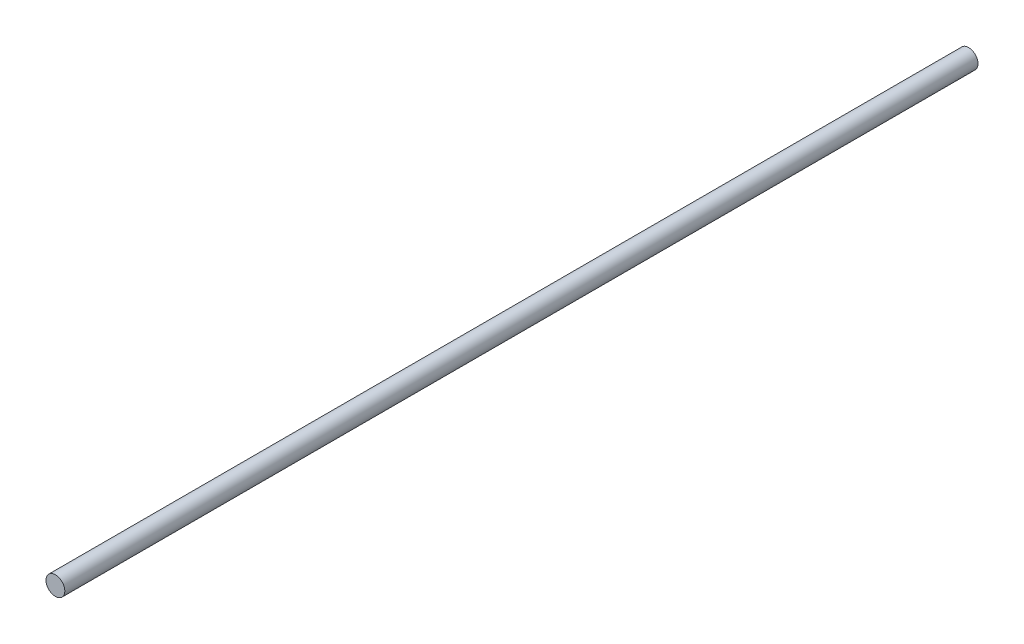
ISO-10303-21;
HEADER;
FILE_DESCRIPTION(('STEP AP214'),'2;1');
FILE_NAME('part.step','',(''),(''),'','','');
FILE_SCHEMA(('AUTOMOTIVE_DESIGN { 1 0 10303 214 1 1 1 1 }'));
ENDSEC;
DATA;
#1=APPLICATION_CONTEXT('core data for automotive mechanical design processes');
#2=APPLICATION_PROTOCOL_DEFINITION('international standard','automotive_design',2000,#1);
#3=PRODUCT_CONTEXT('',#1,'mechanical');
#4=PRODUCT('Part','Part','',(#3));
#5=PRODUCT_RELATED_PRODUCT_CATEGORY('part','',(#4));
#6=PRODUCT_DEFINITION_FORMATION('','',#4);
#7=PRODUCT_DEFINITION_CONTEXT('part definition',#1,'design');
#8=PRODUCT_DEFINITION('design','',#6,#7);
#9=PRODUCT_DEFINITION_SHAPE('','',#8);
#10=(LENGTH_UNIT() NAMED_UNIT(*) SI_UNIT(.MILLI.,.METRE.));
#11=(NAMED_UNIT(*) PLANE_ANGLE_UNIT() SI_UNIT($,.RADIAN.));
#12=(NAMED_UNIT(*) SI_UNIT($,.STERADIAN.) SOLID_ANGLE_UNIT());
#13=UNCERTAINTY_MEASURE_WITH_UNIT(LENGTH_MEASURE(1.E-05),#10,'distance_accuracy_value','');
#14=(GEOMETRIC_REPRESENTATION_CONTEXT(3) GLOBAL_UNCERTAINTY_ASSIGNED_CONTEXT((#13)) GLOBAL_UNIT_ASSIGNED_CONTEXT((#10,
#11,#12)) REPRESENTATION_CONTEXT('',''));
#15=CARTESIAN_POINT('',(0.,0.,0.));
#16=DIRECTION('',(0.,0.,1.));
#17=DIRECTION('',(1.,0.,0.));
#18=AXIS2_PLACEMENT_3D('',#15,#16,#17);
#19=CARTESIAN_POINT('',(20.,0.,-97.));
#20=DIRECTION('',(0.,0.,1.));
#21=DIRECTION('',(1.,0.,0.));
#22=AXIS2_PLACEMENT_3D('',#19,#20,#21);
#23=CYLINDRICAL_SURFACE('',#22,1.);
#24=CARTESIAN_POINT('',(20.,0.,-97.));
#25=DIRECTION('',(0.,0.,1.));
#26=DIRECTION('',(1.,0.,0.));
#27=AXIS2_PLACEMENT_3D('',#24,#25,#26);
#28=CIRCLE('',#27,1.);
#29=CARTESIAN_POINT('',(21.,0.,-97.));
#30=VERTEX_POINT('',#29);
#31=EDGE_CURVE('E10',#30,#30,#28,.T.);
#32=CARTESIAN_POINT('',(20.,0.,0.));
#33=DIRECTION('',(0.,0.,1.));
#34=DIRECTION('',(1.,0.,0.));
#35=AXIS2_PLACEMENT_3D('',#32,#33,#34);
#36=CIRCLE('',#35,1.);
#37=CARTESIAN_POINT('',(21.,0.,0.));
#38=VERTEX_POINT('',#37);
#39=EDGE_CURVE('E34',#38,#38,#36,.T.);
#40=CARTESIAN_POINT('',(21.,0.,-97.));
#41=CARTESIAN_POINT('',(21.,0.,-95.9895833333334));
#42=CARTESIAN_POINT('',(21.,0.,-94.9791666666667));
#43=CARTESIAN_POINT('',(21.,0.,-92.9583333333333));
#44=CARTESIAN_POINT('',(21.,0.,-91.9479166666667));
#45=CARTESIAN_POINT('',(21.,0.,-89.9270833333333));
#46=CARTESIAN_POINT('',(21.,0.,-88.9166666666667));
#47=CARTESIAN_POINT('',(21.,0.,-86.8958333333333));
#48=CARTESIAN_POINT('',(21.,0.,-85.8854166666667));
#49=CARTESIAN_POINT('',(21.,0.,-83.8645833333333));
#50=CARTESIAN_POINT('',(21.,0.,-82.8541666666667));
#51=CARTESIAN_POINT('',(21.,0.,-80.8333333333333));
#52=CARTESIAN_POINT('',(21.,0.,-79.8229166666667));
#53=CARTESIAN_POINT('',(21.,0.,-77.8020833333333));
#54=CARTESIAN_POINT('',(21.,0.,-76.7916666666667));
#55=CARTESIAN_POINT('',(21.,0.,-74.7708333333333));
#56=CARTESIAN_POINT('',(21.,0.,-73.7604166666667));
#57=CARTESIAN_POINT('',(21.,0.,-71.7395833333333));
#58=CARTESIAN_POINT('',(21.,0.,-70.7291666666667));
#59=CARTESIAN_POINT('',(21.,0.,-68.7083333333333));
#60=CARTESIAN_POINT('',(21.,0.,-67.6979166666667));
#61=CARTESIAN_POINT('',(21.,0.,-65.6770833333333));
#62=CARTESIAN_POINT('',(21.,0.,-64.6666666666667));
#63=CARTESIAN_POINT('',(21.,0.,-62.6458333333333));
#64=CARTESIAN_POINT('',(21.,0.,-61.6354166666667));
#65=CARTESIAN_POINT('',(21.,0.,-59.6145833333333));
#66=CARTESIAN_POINT('',(21.,0.,-58.6041666666667));
#67=CARTESIAN_POINT('',(21.,0.,-56.5833333333333));
#68=CARTESIAN_POINT('',(21.,0.,-55.5729166666667));
#69=CARTESIAN_POINT('',(21.,0.,-53.5520833333333));
#70=CARTESIAN_POINT('',(21.,0.,-52.5416666666667));
#71=CARTESIAN_POINT('',(21.,0.,-50.5208333333333));
#72=CARTESIAN_POINT('',(21.,0.,-49.5104166666667));
#73=CARTESIAN_POINT('',(21.,0.,-47.4895833333333));
#74=CARTESIAN_POINT('',(21.,0.,-46.4791666666667));
#75=CARTESIAN_POINT('',(21.,0.,-44.4583333333333));
#76=CARTESIAN_POINT('',(21.,0.,-43.4479166666667));
#77=CARTESIAN_POINT('',(21.,0.,-41.4270833333333));
#78=CARTESIAN_POINT('',(21.,0.,-40.4166666666667));
#79=CARTESIAN_POINT('',(21.,0.,-38.3958333333333));
#80=CARTESIAN_POINT('',(21.,0.,-37.3854166666667));
#81=CARTESIAN_POINT('',(21.,0.,-35.3645833333333));
#82=CARTESIAN_POINT('',(21.,0.,-34.3541666666667));
#83=CARTESIAN_POINT('',(21.,0.,-32.3333333333333));
#84=CARTESIAN_POINT('',(21.,0.,-31.3229166666667));
#85=CARTESIAN_POINT('',(21.,0.,-29.3020833333334));
#86=CARTESIAN_POINT('',(21.,0.,-28.2916666666667));
#87=CARTESIAN_POINT('',(21.,0.,-26.2708333333334));
#88=CARTESIAN_POINT('',(21.,0.,-25.2604166666667));
#89=CARTESIAN_POINT('',(21.,0.,-23.2395833333334));
#90=CARTESIAN_POINT('',(21.,0.,-22.2291666666667));
#91=CARTESIAN_POINT('',(21.,0.,-20.2083333333334));
#92=CARTESIAN_POINT('',(21.,0.,-19.1979166666667));
#93=CARTESIAN_POINT('',(21.,0.,-17.1770833333334));
#94=CARTESIAN_POINT('',(21.,0.,-16.1666666666667));
#95=CARTESIAN_POINT('',(21.,0.,-14.1458333333333));
#96=CARTESIAN_POINT('',(21.,0.,-13.1354166666667));
#97=CARTESIAN_POINT('',(21.,0.,-11.1145833333333));
#98=CARTESIAN_POINT('',(21.,0.,-10.1041666666667));
#99=CARTESIAN_POINT('',(21.,0.,-8.08333333333334));
#100=CARTESIAN_POINT('',(21.,0.,-7.07291666666668));
#101=CARTESIAN_POINT('',(21.,0.,-5.05208333333335));
#102=CARTESIAN_POINT('',(21.,0.,-4.04166666666668));
#103=CARTESIAN_POINT('',(21.,0.,-2.02083333333335));
#104=CARTESIAN_POINT('',(21.,0.,-1.01041666666668));
#105=CARTESIAN_POINT('',(21.,0.,0.));
#106=B_SPLINE_CURVE_WITH_KNOTS('',3,(#40,#41,#42,#43,#44,#45,#46,#47,#48,#49,#50,#51,#52,#53,
#54,#55,#56,#57,#58,#59,#60,#61,#62,#63,#64,#65,#66,#67,#68,#69,#70,#71,#72,#73,#74,#75,#76,#77,
#78,#79,#80,#81,#82,#83,#84,#85,#86,#87,#88,#89,#90,#91,#92,#93,#94,#95,#96,#97,#98,#99,#100,
#101,#102,#103,#104,#105),.UNSPECIFIED.,.F.,.F.,(4,2,2,2,2,2,2,2,2,2,2,2,2,2,2,2,2,2,2,2,2,2,2,
2,2,2,2,2,2,2,2,2,4),(0.,3.03125000000001,6.06250000000001,9.09375000000001,12.125,15.15625,
18.1875,21.21875,24.25,27.28125,30.3125,33.34375,36.375,39.40625,42.4375,45.46875,48.5,51.53125,
54.5625,57.59375,60.625,63.65625,66.6875,69.71875,72.75,75.78125,78.8125,81.84375,84.875,
87.90625,90.9375,93.96875,97.),.UNSPECIFIED.);
#107=EDGE_CURVE('BSEAM31',#30,#38,#106,.T.);
#108=ORIENTED_EDGE('',*,*,#31,.T.);
#109=ORIENTED_EDGE('',*,*,#39,.F.);
#110=ORIENTED_EDGE('',*,*,#107,.T.);
#111=ORIENTED_EDGE('',*,*,#107,.F.);
#112=EDGE_LOOP('',(#108,#110,#109,#111));
#113=FACE_BOUND('',#112,.T.);
#114=ADVANCED_FACE('F31',(#113),#23,.T.);
#115=CARTESIAN_POINT('',(20.,0.,-97.));
#116=DIRECTION('',(0.,0.,1.));
#117=DIRECTION('',(1.,0.,0.));
#118=AXIS2_PLACEMENT_3D('',#115,#116,#117);
#119=PLANE('',#118);
#120=ORIENTED_EDGE('',*,*,#31,.F.);
#121=EDGE_LOOP('',(#120));
#122=FACE_BOUND('',#121,.T.);
#123=ADVANCED_FACE('F46',(#122),#119,.F.);
#124=CARTESIAN_POINT('',(20.,0.,0.));
#125=DIRECTION('',(0.,0.,1.));
#126=DIRECTION('',(1.,0.,0.));
#127=AXIS2_PLACEMENT_3D('',#124,#125,#126);
#128=PLANE('',#127);
#129=ORIENTED_EDGE('',*,*,#39,.T.);
#130=EDGE_LOOP('',(#129));
#131=FACE_BOUND('',#130,.T.);
#132=ADVANCED_FACE('F43',(#131),#128,.T.);
#133=CLOSED_SHELL('',(#114,#123,#132));
#134=MANIFOLD_SOLID_BREP('B2',#133);
#135=ADVANCED_BREP_SHAPE_REPRESENTATION('',(#18,#134),#14);
#136=SHAPE_DEFINITION_REPRESENTATION(#9,#135);
ENDSEC;
END-ISO-10303-21;
